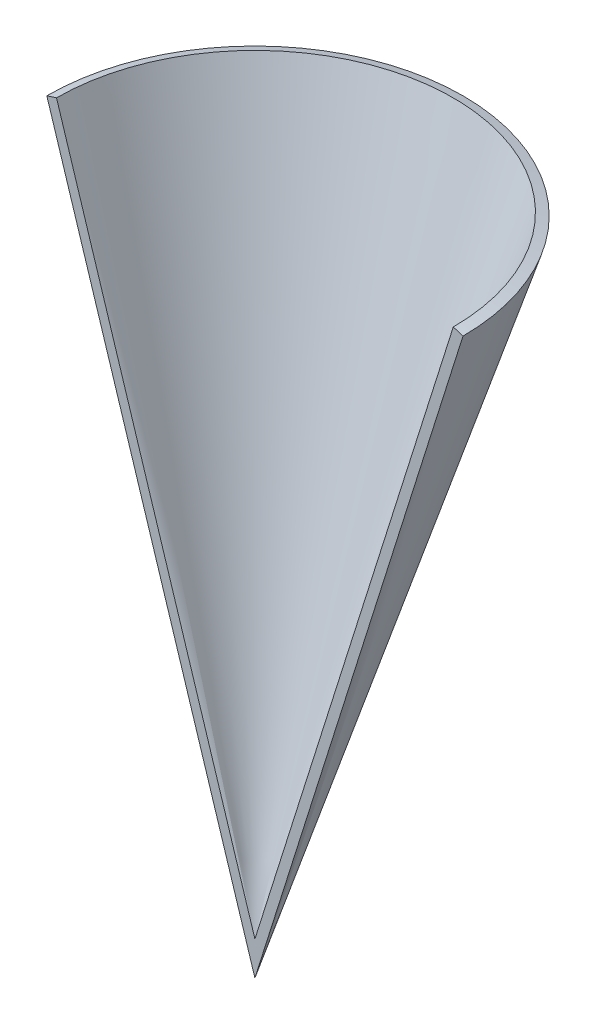
ISO-10303-21;
HEADER;
FILE_DESCRIPTION(('STEP AP214'),'2;1');
FILE_NAME('part.step','',(''),(''),'','','');
FILE_SCHEMA(('AUTOMOTIVE_DESIGN { 1 0 10303 214 1 1 1 1 }'));
ENDSEC;
DATA;
#1=APPLICATION_CONTEXT('core data for automotive mechanical design processes');
#2=APPLICATION_PROTOCOL_DEFINITION('international standard','automotive_design',2000,#1);
#3=PRODUCT_CONTEXT('',#1,'mechanical');
#4=PRODUCT('Part','Part','',(#3));
#5=PRODUCT_RELATED_PRODUCT_CATEGORY('part','',(#4));
#6=PRODUCT_DEFINITION_FORMATION('','',#4);
#7=PRODUCT_DEFINITION_CONTEXT('part definition',#1,'design');
#8=PRODUCT_DEFINITION('design','',#6,#7);
#9=PRODUCT_DEFINITION_SHAPE('','',#8);
#10=(LENGTH_UNIT() NAMED_UNIT(*) SI_UNIT(.MILLI.,.METRE.));
#11=(NAMED_UNIT(*) PLANE_ANGLE_UNIT() SI_UNIT($,.RADIAN.));
#12=(NAMED_UNIT(*) SI_UNIT($,.STERADIAN.) SOLID_ANGLE_UNIT());
#13=UNCERTAINTY_MEASURE_WITH_UNIT(LENGTH_MEASURE(1.E-05),#10,'distance_accuracy_value','');
#14=(GEOMETRIC_REPRESENTATION_CONTEXT(3) GLOBAL_UNCERTAINTY_ASSIGNED_CONTEXT((#13)) GLOBAL_UNIT_ASSIGNED_CONTEXT((#10,
#11,#12)) REPRESENTATION_CONTEXT('',''));
#15=CARTESIAN_POINT('',(0.,0.,0.));
#16=DIRECTION('',(0.,0.,1.));
#17=DIRECTION('',(1.,0.,0.));
#18=AXIS2_PLACEMENT_3D('',#15,#16,#17);
#19=CARTESIAN_POINT('',(0.,0.,0.));
#20=DIRECTION('',(0.,1.,0.));
#21=DIRECTION('',(0.,0.,1.));
#22=AXIS2_PLACEMENT_3D('',#19,#20,#21);
#23=CONICAL_SURFACE('',#22,0.,0.305432619099002);
#24=CARTESIAN_POINT('',(0.,129.831701326736,0.));
#25=DIRECTION('',(0.,-1.,0.));
#26=DIRECTION('',(0.,0.,-1.));
#27=AXIS2_PLACEMENT_3D('',#24,#25,#26);
#28=CIRCLE('',#27,40.935778186417);
#29=CARTESIAN_POINT('',(-40.935778186417,129.831701326736,2.85853011257793E-13));
#30=VERTEX_POINT('',#29);
#31=CARTESIAN_POINT('',(40.935778186417,129.831701326736,0.));
#32=VERTEX_POINT('',#31);
#33=EDGE_CURVE('E11',#30,#32,#28,.T.);
#34=ORIENTED_EDGE('',*,*,#33,.T.);
#35=DIRECTION('',(0.300705799504268,0.953716950748229,0.));
#36=VECTOR('',#35,1.);
#37=CARTESIAN_POINT('',(40.935778186417,129.831701326736,0.));
#38=LINE('',#37,#36);
#39=CARTESIAN_POINT('',(0.,0.,0.));
#40=VERTEX_POINT('',#39);
#41=EDGE_CURVE('E58',#40,#32,#38,.T.);
#42=ORIENTED_EDGE('',*,*,#41,.F.);
#43=DIRECTION('',(-0.300705799504268,0.953716950748229,0.));
#44=VECTOR('',#43,1.);
#45=CARTESIAN_POINT('',(-40.935778186417,129.831701326736,2.85853011257793E-13));
#46=LINE('',#45,#44);
#47=EDGE_CURVE('E78',#40,#30,#46,.T.);
#48=ORIENTED_EDGE('',*,*,#47,.T.);
#49=EDGE_LOOP('',(#34,#42,#48));
#50=FACE_BOUND('',#49,.T.);
#51=ADVANCED_FACE('F43',(#50),#23,.T.);
#52=CARTESIAN_POINT('',(0.,129.831701326736,0.));
#53=DIRECTION('',(0.,-1.,0.));
#54=DIRECTION('',(0.,0.,-1.));
#55=AXIS2_PLACEMENT_3D('',#52,#53,#54);
#56=CONICAL_SURFACE('',#55,40.935778186417,1.26536370769589);
#57=CARTESIAN_POINT('',(0.,130.433112925744,0.));
#58=DIRECTION('',(0.,-1.,0.));
#59=DIRECTION('',(0.,0.,-1.));
#60=AXIS2_PLACEMENT_3D('',#57,#58,#59);
#61=CIRCLE('',#60,39.0283442849205);
#62=CARTESIAN_POINT('',(-39.0283442849205,130.433112925744,2.7253347151349E-13));
#63=VERTEX_POINT('',#62);
#64=CARTESIAN_POINT('',(39.0283442849205,130.433112925744,0.));
#65=VERTEX_POINT('',#64);
#66=EDGE_CURVE('E52',#63,#65,#61,.T.);
#67=ORIENTED_EDGE('',*,*,#66,.T.);
#68=DIRECTION('',(-0.953716950748228,0.300705799504268,0.));
#69=VECTOR('',#68,1.);
#70=CARTESIAN_POINT('',(39.0283442849205,130.433112925744,0.));
#71=LINE('',#70,#69);
#72=EDGE_CURVE('E84',#32,#65,#71,.T.);
#73=ORIENTED_EDGE('',*,*,#72,.F.);
#74=ORIENTED_EDGE('',*,*,#33,.F.);
#75=DIRECTION('',(0.953716950748228,0.300705799504268,0.));
#76=VECTOR('',#75,1.);
#77=CARTESIAN_POINT('',(-39.0283442849205,130.433112925744,2.7253347151349E-13));
#78=LINE('',#77,#76);
#79=EDGE_CURVE('E94',#30,#63,#78,.T.);
#80=ORIENTED_EDGE('',*,*,#79,.T.);
#81=EDGE_LOOP('',(#67,#73,#74,#80));
#82=FACE_BOUND('',#81,.T.);
#83=ADVANCED_FACE('F45',(#82),#56,.T.);
#84=CARTESIAN_POINT('',(0.,130.433112925744,0.));
#85=DIRECTION('',(0.,1.,0.));
#86=DIRECTION('',(0.,0.,1.));
#87=AXIS2_PLACEMENT_3D('',#84,#85,#86);
#88=CONICAL_SURFACE('',#87,39.0283442849205,0.305432619099008);
#89=DIRECTION('',(-0.300705799504274,-0.953716950748227,0.));
#90=VECTOR('',#89,1.);
#91=CARTESIAN_POINT('',(0.,6.65101904684882,0.));
#92=LINE('',#91,#90);
#93=CARTESIAN_POINT('',(0.,6.65101904684882,0.));
#94=VERTEX_POINT('',#93);
#95=EDGE_CURVE('E66',#65,#94,#92,.T.);
#96=ORIENTED_EDGE('',*,*,#95,.F.);
#97=ORIENTED_EDGE('',*,*,#66,.F.);
#98=DIRECTION('',(0.300705799504274,-0.953716950748227,0.));
#99=VECTOR('',#98,1.);
#100=CARTESIAN_POINT('',(0.,6.65101904684882,0.));
#101=LINE('',#100,#99);
#102=EDGE_CURVE('E97',#63,#94,#101,.T.);
#103=ORIENTED_EDGE('',*,*,#102,.T.);
#104=EDGE_LOOP('',(#96,#97,#103));
#105=FACE_BOUND('',#104,.T.);
#106=ADVANCED_FACE('F101',(#105),#88,.F.);
#107=CARTESIAN_POINT('',(0.,0.,0.));
#108=DIRECTION('',(0.,0.,-1.));
#109=DIRECTION('',(-1.,0.,0.));
#110=AXIS2_PLACEMENT_3D('',#107,#108,#109);
#111=PLANE('',#110);
#112=ORIENTED_EDGE('',*,*,#47,.F.);
#113=ORIENTED_EDGE('',*,*,#41,.T.);
#114=ORIENTED_EDGE('',*,*,#72,.T.);
#115=ORIENTED_EDGE('',*,*,#95,.T.);
#116=ORIENTED_EDGE('',*,*,#102,.F.);
#117=ORIENTED_EDGE('',*,*,#79,.F.);
#118=EDGE_LOOP('',(#112,#113,#114,#115,#116,#117));
#119=FACE_BOUND('',#118,.T.);
#120=ADVANCED_FACE('F83',(#119),#111,.F.);
#121=CLOSED_SHELL('',(#51,#83,#106,#120));
#122=MANIFOLD_SOLID_BREP('B2',#121);
#123=ADVANCED_BREP_SHAPE_REPRESENTATION('',(#18,#122),#14);
#124=SHAPE_DEFINITION_REPRESENTATION(#9,#123);
ENDSEC;
END-ISO-10303-21;
